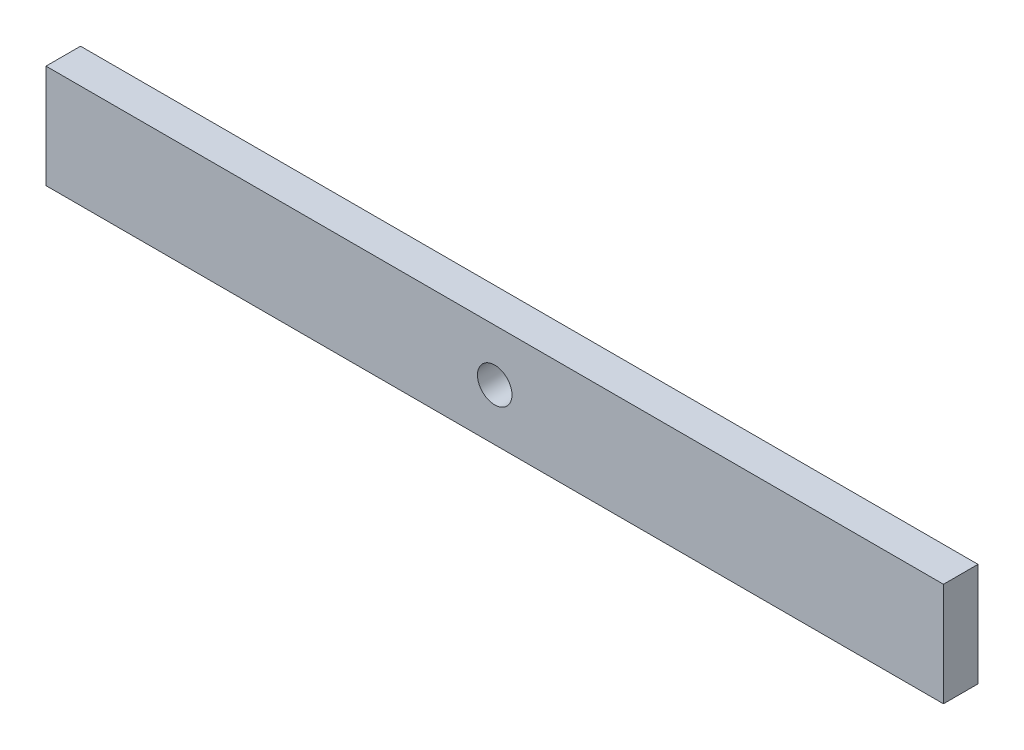
ISO-10303-21;
HEADER;
FILE_DESCRIPTION(('STEP AP214'),'2;1');
FILE_NAME('part.step','',(''),(''),'','','');
FILE_SCHEMA(('AUTOMOTIVE_DESIGN { 1 0 10303 214 1 1 1 1 }'));
ENDSEC;
DATA;
#1=APPLICATION_CONTEXT('core data for automotive mechanical design processes');
#2=APPLICATION_PROTOCOL_DEFINITION('international standard','automotive_design',2000,#1);
#3=PRODUCT_CONTEXT('',#1,'mechanical');
#4=PRODUCT('Part','Part','',(#3));
#5=PRODUCT_RELATED_PRODUCT_CATEGORY('part','',(#4));
#6=PRODUCT_DEFINITION_FORMATION('','',#4);
#7=PRODUCT_DEFINITION_CONTEXT('part definition',#1,'design');
#8=PRODUCT_DEFINITION('design','',#6,#7);
#9=PRODUCT_DEFINITION_SHAPE('','',#8);
#10=(LENGTH_UNIT() NAMED_UNIT(*) SI_UNIT(.MILLI.,.METRE.));
#11=(NAMED_UNIT(*) PLANE_ANGLE_UNIT() SI_UNIT($,.RADIAN.));
#12=(NAMED_UNIT(*) SI_UNIT($,.STERADIAN.) SOLID_ANGLE_UNIT());
#13=UNCERTAINTY_MEASURE_WITH_UNIT(LENGTH_MEASURE(1.E-05),#10,'distance_accuracy_value','');
#14=(GEOMETRIC_REPRESENTATION_CONTEXT(3) GLOBAL_UNCERTAINTY_ASSIGNED_CONTEXT((#13)) GLOBAL_UNIT_ASSIGNED_CONTEXT((#10,
#11,#12)) REPRESENTATION_CONTEXT('',''));
#15=CARTESIAN_POINT('',(0.,0.,0.));
#16=DIRECTION('',(0.,0.,1.));
#17=DIRECTION('',(1.,0.,0.));
#18=AXIS2_PLACEMENT_3D('',#15,#16,#17);
#19=CARTESIAN_POINT('',(130.,-15.,10.));
#20=DIRECTION('',(-1.,0.,0.));
#21=DIRECTION('',(0.,0.,1.));
#22=AXIS2_PLACEMENT_3D('',#19,#20,#21);
#23=PLANE('',#22);
#24=DIRECTION('',(0.,1.,0.));
#25=VECTOR('',#24,1.);
#26=CARTESIAN_POINT('',(130.,-15.,0.));
#27=LINE('',#26,#25);
#28=CARTESIAN_POINT('',(130.,-15.,0.));
#29=VERTEX_POINT('',#28);
#30=CARTESIAN_POINT('',(130.,15.,0.));
#31=VERTEX_POINT('',#30);
#32=EDGE_CURVE('E102',#29,#31,#27,.T.);
#33=ORIENTED_EDGE('',*,*,#32,.T.);
#34=DIRECTION('',(0.,0.,-1.));
#35=VECTOR('',#34,1.);
#36=CARTESIAN_POINT('',(130.,15.,10.));
#37=LINE('',#36,#35);
#38=CARTESIAN_POINT('',(130.,15.,10.));
#39=VERTEX_POINT('',#38);
#40=EDGE_CURVE('E11',#39,#31,#37,.T.);
#41=ORIENTED_EDGE('',*,*,#40,.F.);
#42=DIRECTION('',(0.,1.,0.));
#43=VECTOR('',#42,1.);
#44=CARTESIAN_POINT('',(130.,-15.,10.));
#45=LINE('',#44,#43);
#46=CARTESIAN_POINT('',(130.,-15.,10.));
#47=VERTEX_POINT('',#46);
#48=EDGE_CURVE('E90',#47,#39,#45,.T.);
#49=ORIENTED_EDGE('',*,*,#48,.F.);
#50=DIRECTION('',(0.,0.,-1.));
#51=VECTOR('',#50,1.);
#52=CARTESIAN_POINT('',(130.,-15.,10.));
#53=LINE('',#52,#51);
#54=EDGE_CURVE('E98',#47,#29,#53,.T.);
#55=ORIENTED_EDGE('',*,*,#54,.T.);
#56=EDGE_LOOP('',(#33,#41,#49,#55));
#57=FACE_BOUND('',#56,.T.);
#58=ADVANCED_FACE('F39',(#57),#23,.F.);
#59=CARTESIAN_POINT('',(-130.,15.,10.));
#60=DIRECTION('',(0.,-1.,0.));
#61=DIRECTION('',(1.,0.,0.));
#62=AXIS2_PLACEMENT_3D('',#59,#60,#61);
#63=PLANE('',#62);
#64=DIRECTION('',(-1.,0.,0.));
#65=VECTOR('',#64,1.);
#66=CARTESIAN_POINT('',(-130.,15.,0.));
#67=LINE('',#66,#65);
#68=CARTESIAN_POINT('',(-130.,15.,0.));
#69=VERTEX_POINT('',#68);
#70=EDGE_CURVE('E94',#31,#69,#67,.T.);
#71=ORIENTED_EDGE('',*,*,#70,.T.);
#72=DIRECTION('',(0.,0.,-1.));
#73=VECTOR('',#72,1.);
#74=CARTESIAN_POINT('',(-130.,15.,10.));
#75=LINE('',#74,#73);
#76=CARTESIAN_POINT('',(-130.,15.,10.));
#77=VERTEX_POINT('',#76);
#78=EDGE_CURVE('E47',#77,#69,#75,.T.);
#79=ORIENTED_EDGE('',*,*,#78,.F.);
#80=DIRECTION('',(-1.,0.,0.));
#81=VECTOR('',#80,1.);
#82=CARTESIAN_POINT('',(-130.,15.,10.));
#83=LINE('',#82,#81);
#84=EDGE_CURVE('E85',#39,#77,#83,.T.);
#85=ORIENTED_EDGE('',*,*,#84,.F.);
#86=ORIENTED_EDGE('',*,*,#40,.T.);
#87=EDGE_LOOP('',(#71,#79,#85,#86));
#88=FACE_BOUND('',#87,.T.);
#89=ADVANCED_FACE('F93',(#88),#63,.F.);
#90=CARTESIAN_POINT('',(-130.,-15.,10.));
#91=DIRECTION('',(1.,0.,0.));
#92=DIRECTION('',(0.,0.,-1.));
#93=AXIS2_PLACEMENT_3D('',#90,#91,#92);
#94=PLANE('',#93);
#95=DIRECTION('',(0.,-1.,0.));
#96=VECTOR('',#95,1.);
#97=CARTESIAN_POINT('',(-130.,-15.,0.));
#98=LINE('',#97,#96);
#99=CARTESIAN_POINT('',(-130.,-15.,0.));
#100=VERTEX_POINT('',#99);
#101=EDGE_CURVE('E72',#69,#100,#98,.T.);
#102=ORIENTED_EDGE('',*,*,#101,.T.);
#103=DIRECTION('',(0.,0.,-1.));
#104=VECTOR('',#103,1.);
#105=CARTESIAN_POINT('',(-130.,-15.,10.));
#106=LINE('',#105,#104);
#107=CARTESIAN_POINT('',(-130.,-15.,10.));
#108=VERTEX_POINT('',#107);
#109=EDGE_CURVE('E95',#108,#100,#106,.T.);
#110=ORIENTED_EDGE('',*,*,#109,.F.);
#111=DIRECTION('',(0.,-1.,0.));
#112=VECTOR('',#111,1.);
#113=CARTESIAN_POINT('',(-130.,-15.,10.));
#114=LINE('',#113,#112);
#115=EDGE_CURVE('E88',#77,#108,#114,.T.);
#116=ORIENTED_EDGE('',*,*,#115,.F.);
#117=ORIENTED_EDGE('',*,*,#78,.T.);
#118=EDGE_LOOP('',(#102,#110,#116,#117));
#119=FACE_BOUND('',#118,.T.);
#120=ADVANCED_FACE('F96',(#119),#94,.F.);
#121=CARTESIAN_POINT('',(-130.,-15.,10.));
#122=DIRECTION('',(0.,1.,0.));
#123=DIRECTION('',(0.,0.,1.));
#124=AXIS2_PLACEMENT_3D('',#121,#122,#123);
#125=PLANE('',#124);
#126=DIRECTION('',(1.,0.,0.));
#127=VECTOR('',#126,1.);
#128=CARTESIAN_POINT('',(-130.,-15.,0.));
#129=LINE('',#128,#127);
#130=EDGE_CURVE('E78',#100,#29,#129,.T.);
#131=ORIENTED_EDGE('',*,*,#130,.T.);
#132=ORIENTED_EDGE('',*,*,#54,.F.);
#133=DIRECTION('',(1.,0.,0.));
#134=VECTOR('',#133,1.);
#135=CARTESIAN_POINT('',(-130.,-15.,10.));
#136=LINE('',#135,#134);
#137=EDGE_CURVE('E55',#108,#47,#136,.T.);
#138=ORIENTED_EDGE('',*,*,#137,.F.);
#139=ORIENTED_EDGE('',*,*,#109,.T.);
#140=EDGE_LOOP('',(#131,#132,#138,#139));
#141=FACE_BOUND('',#140,.T.);
#142=ADVANCED_FACE('F110',(#141),#125,.F.);
#143=CARTESIAN_POINT('',(0.,0.,10.));
#144=DIRECTION('',(0.,0.,-1.));
#145=DIRECTION('',(-1.,0.,0.));
#146=AXIS2_PLACEMENT_3D('',#143,#144,#145);
#147=PLANE('',#146);
#148=CARTESIAN_POINT('',(0.,0.,10.));
#149=DIRECTION('',(0.,0.,1.));
#150=DIRECTION('',(1.,0.,0.));
#151=AXIS2_PLACEMENT_3D('',#148,#149,#150);
#152=CIRCLE('',#151,5.);
#153=CARTESIAN_POINT('',(5.,0.,10.));
#154=VERTEX_POINT('',#153);
#155=EDGE_CURVE('E116',#154,#154,#152,.T.);
#156=ORIENTED_EDGE('',*,*,#155,.F.);
#157=EDGE_LOOP('',(#156));
#158=FACE_BOUND('',#157,.T.);
#159=ORIENTED_EDGE('',*,*,#48,.T.);
#160=ORIENTED_EDGE('',*,*,#84,.T.);
#161=ORIENTED_EDGE('',*,*,#115,.T.);
#162=ORIENTED_EDGE('',*,*,#137,.T.);
#163=EDGE_LOOP('',(#159,#160,#161,#162));
#164=FACE_BOUND('',#163,.T.);
#165=ADVANCED_FACE('F86',(#158,#164),#147,.F.);
#166=CARTESIAN_POINT('',(0.,0.,0.));
#167=DIRECTION('',(0.,0.,-1.));
#168=DIRECTION('',(-1.,0.,0.));
#169=AXIS2_PLACEMENT_3D('',#166,#167,#168);
#170=PLANE('',#169);
#171=CARTESIAN_POINT('',(0.,0.,0.));
#172=DIRECTION('',(0.,0.,1.));
#173=DIRECTION('',(1.,0.,0.));
#174=AXIS2_PLACEMENT_3D('',#171,#172,#173);
#175=CIRCLE('',#174,5.);
#176=CARTESIAN_POINT('',(5.,0.,0.));
#177=VERTEX_POINT('',#176);
#178=EDGE_CURVE('E105',#177,#177,#175,.T.);
#179=ORIENTED_EDGE('',*,*,#178,.T.);
#180=EDGE_LOOP('',(#179));
#181=FACE_BOUND('',#180,.T.);
#182=ORIENTED_EDGE('',*,*,#32,.F.);
#183=ORIENTED_EDGE('',*,*,#130,.F.);
#184=ORIENTED_EDGE('',*,*,#101,.F.);
#185=ORIENTED_EDGE('',*,*,#70,.F.);
#186=EDGE_LOOP('',(#182,#183,#184,#185));
#187=FACE_BOUND('',#186,.T.);
#188=ADVANCED_FACE('F113',(#181,#187),#170,.T.);
#189=CARTESIAN_POINT('',(0.,0.,0.));
#190=DIRECTION('',(0.,0.,1.));
#191=DIRECTION('',(1.,0.,0.));
#192=AXIS2_PLACEMENT_3D('',#189,#190,#191);
#193=CYLINDRICAL_SURFACE('',#192,5.);
#194=ORIENTED_EDGE('',*,*,#178,.F.);
#195=EDGE_LOOP('',(#194));
#196=FACE_BOUND('',#195,.T.);
#197=ORIENTED_EDGE('',*,*,#155,.T.);
#198=EDGE_LOOP('',(#197));
#199=FACE_BOUND('',#198,.T.);
#200=ADVANCED_FACE('F123',(#196,#199),#193,.F.);
#201=CLOSED_SHELL('',(#58,#89,#120,#142,#165,#188,#200));
#202=MANIFOLD_SOLID_BREP('B2',#201);
#203=ADVANCED_BREP_SHAPE_REPRESENTATION('',(#18,#202),#14);
#204=SHAPE_DEFINITION_REPRESENTATION(#9,#203);
ENDSEC;
END-ISO-10303-21;
